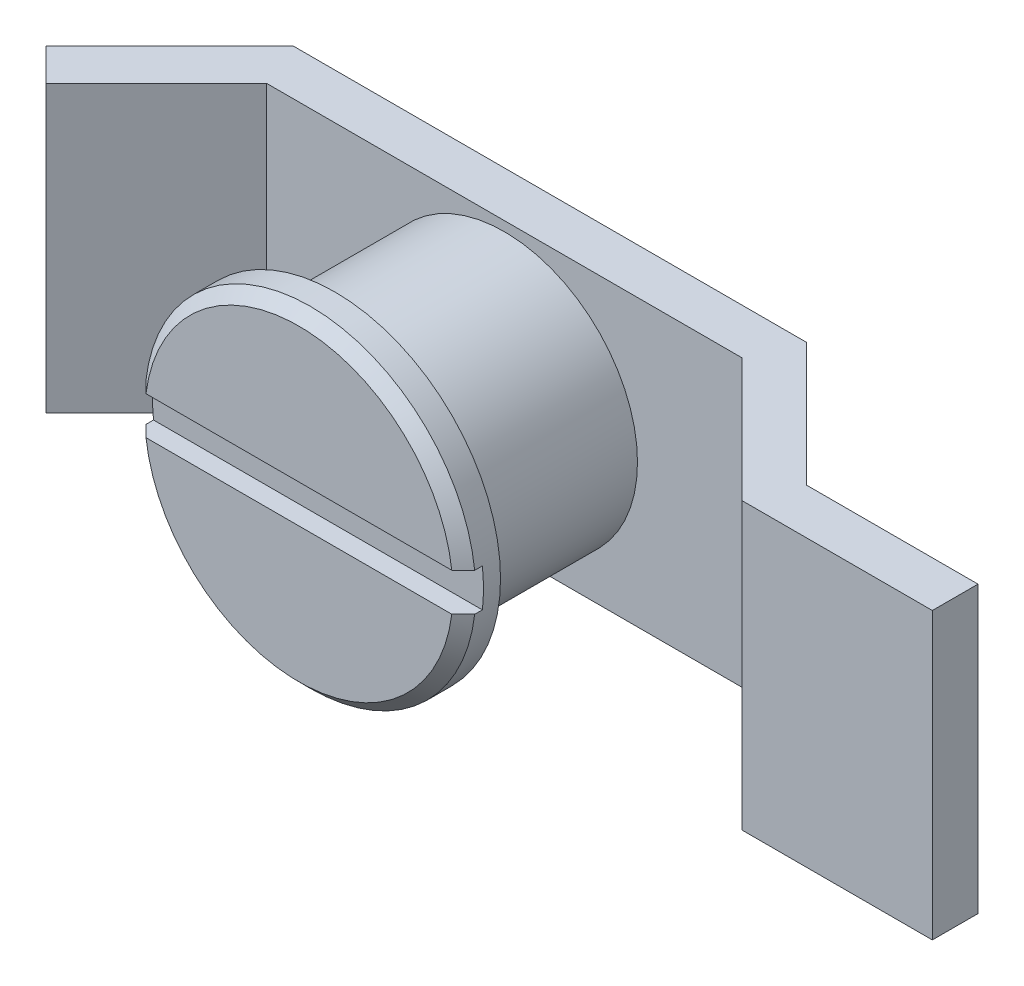
ISO-10303-21;
HEADER;
FILE_DESCRIPTION(('STEP AP214'),'2;1');
FILE_NAME('part.step','',(''),(''),'','','');
FILE_SCHEMA(('AUTOMOTIVE_DESIGN { 1 0 10303 214 1 1 1 1 }'));
ENDSEC;
DATA;
#1=APPLICATION_CONTEXT('core data for automotive mechanical design processes');
#2=APPLICATION_PROTOCOL_DEFINITION('international standard','automotive_design',2000,#1);
#3=PRODUCT_CONTEXT('',#1,'mechanical');
#4=PRODUCT('Part','Part','',(#3));
#5=PRODUCT_RELATED_PRODUCT_CATEGORY('part','',(#4));
#6=PRODUCT_DEFINITION_FORMATION('','',#4);
#7=PRODUCT_DEFINITION_CONTEXT('part definition',#1,'design');
#8=PRODUCT_DEFINITION('design','',#6,#7);
#9=PRODUCT_DEFINITION_SHAPE('','',#8);
#10=(LENGTH_UNIT() NAMED_UNIT(*) SI_UNIT(.MILLI.,.METRE.));
#11=(NAMED_UNIT(*) PLANE_ANGLE_UNIT() SI_UNIT($,.RADIAN.));
#12=(NAMED_UNIT(*) SI_UNIT($,.STERADIAN.) SOLID_ANGLE_UNIT());
#13=UNCERTAINTY_MEASURE_WITH_UNIT(LENGTH_MEASURE(1.E-05),#10,'distance_accuracy_value','');
#14=(GEOMETRIC_REPRESENTATION_CONTEXT(3) GLOBAL_UNCERTAINTY_ASSIGNED_CONTEXT((#13)) GLOBAL_UNIT_ASSIGNED_CONTEXT((#10,
#11,#12)) REPRESENTATION_CONTEXT('',''));
#15=CARTESIAN_POINT('',(0.,0.,0.));
#16=DIRECTION('',(0.,0.,1.));
#17=DIRECTION('',(1.,0.,0.));
#18=AXIS2_PLACEMENT_3D('',#15,#16,#17);
#19=CARTESIAN_POINT('',(327.787,-1.27,325.4375));
#20=DIRECTION('',(0.,0.,1.));
#21=DIRECTION('',(1.,0.,0.));
#22=AXIS2_PLACEMENT_3D('',#19,#20,#21);
#23=PLANE('',#22);
#24=DIRECTION('',(1.,0.,0.));
#25=VECTOR('',#24,1.);
#26=CARTESIAN_POINT('',(327.787,-1.27,325.4375));
#27=LINE('',#26,#25);
#28=CARTESIAN_POINT('',(327.860231188659,-1.27,325.4375));
#29=VERTEX_POINT('',#28);
#30=CARTESIAN_POINT('',(349.811768811341,-1.27,325.4375));
#31=VERTEX_POINT('',#30);
#32=EDGE_CURVE('E129',#29,#31,#27,.T.);
#33=ORIENTED_EDGE('',*,*,#32,.T.);
#34=CARTESIAN_POINT('',(338.836,0.,325.4375));
#35=DIRECTION('',(0.,0.,1.));
#36=DIRECTION('',(1.,0.,0.));
#37=AXIS2_PLACEMENT_3D('',#34,#35,#36);
#38=CIRCLE('',#37,11.0489999999999);
#39=CARTESIAN_POINT('',(349.811768811341,1.27,325.4375));
#40=VERTEX_POINT('',#39);
#41=EDGE_CURVE('E136',#31,#40,#38,.T.);
#42=ORIENTED_EDGE('',*,*,#41,.T.);
#43=DIRECTION('',(1.,0.,0.));
#44=VECTOR('',#43,1.);
#45=CARTESIAN_POINT('',(327.787,1.27,325.4375));
#46=LINE('',#45,#44);
#47=CARTESIAN_POINT('',(327.860231188659,1.27,325.4375));
#48=VERTEX_POINT('',#47);
#49=EDGE_CURVE('E131',#40,#48,#46,.F.);
#50=ORIENTED_EDGE('',*,*,#49,.T.);
#51=CARTESIAN_POINT('',(338.836,0.,325.4375));
#52=DIRECTION('',(0.,0.,1.));
#53=DIRECTION('',(1.,0.,0.));
#54=AXIS2_PLACEMENT_3D('',#51,#52,#53);
#55=CIRCLE('',#54,11.0489999999999);
#56=EDGE_CURVE('E20',#48,#29,#55,.T.);
#57=ORIENTED_EDGE('',*,*,#56,.T.);
#58=EDGE_LOOP('',(#33,#42,#50,#57));
#59=FACE_BOUND('',#58,.T.);
#60=ADVANCED_FACE('F17',(#59),#23,.T.);
#61=CARTESIAN_POINT('',(327.787,-1.27,325.4375));
#62=DIRECTION('',(0.,-1.,0.));
#63=DIRECTION('',(0.,0.,-1.));
#64=AXIS2_PLACEMENT_3D('',#61,#62,#63);
#65=PLANE('',#64);
#66=CARTESIAN_POINT('',(328.627695050374,-1.27000227202775,326.707501914625));
#67=CARTESIAN_POINT('',(328.499752182231,-1.27000113601387,326.580533914244));
#68=CARTESIAN_POINT('',(328.371825392162,-1.27000037867129,326.453549720541));
#69=CARTESIAN_POINT('',(328.116003968263,-1.26999962132871,326.199548946578));
#70=CARTESIAN_POINT('',(327.988109334432,-1.26999962132871,326.072532366318));
#71=CARTESIAN_POINT('',(327.860230778677,-1.27,325.945499592735));
#72=B_SPLINE_CURVE_WITH_KNOTS('',3,(#66,#67,#68,#69,#70,#71),.UNSPECIFIED.,.F.,.F.,(4,2,4),(0.,
0.54075155257568,1.08150310478243),.UNSPECIFIED.);
#73=CARTESIAN_POINT('',(328.627696296441,-1.27,326.707500218524));
#74=VERTEX_POINT('',#73);
#75=CARTESIAN_POINT('',(327.860231188659,-1.27,325.9455));
#76=VERTEX_POINT('',#75);
#77=EDGE_CURVE('E149',#74,#76,#72,.T.);
#78=ORIENTED_EDGE('',*,*,#77,.F.);
#79=DIRECTION('',(-1.,0.,0.));
#80=VECTOR('',#79,1.);
#81=CARTESIAN_POINT('',(328.549,-1.27,326.7075));
#82=LINE('',#81,#80);
#83=CARTESIAN_POINT('',(349.044303971894,-1.27,326.707499952242));
#84=VERTEX_POINT('',#83);
#85=EDGE_CURVE('E457',#74,#84,#82,.F.);
#86=ORIENTED_EDGE('',*,*,#85,.T.);
#87=CARTESIAN_POINT('',(349.811768482112,-1.26999971037997,325.945499950752));
#88=CARTESIAN_POINT('',(349.683890446107,-1.26999985518999,326.072532885104));
#89=CARTESIAN_POINT('',(349.555996056306,-1.26999995173,326.199549348382));
#90=CARTESIAN_POINT('',(349.300174568969,-1.27000004827001,326.453549332933));
#91=CARTESIAN_POINT('',(349.172247471432,-1.27000004827001,326.580532854206));
#92=CARTESIAN_POINT('',(349.044304020099,-1.27,326.707499904405));
#93=B_SPLINE_CURVE_WITH_KNOTS('',3,(#87,#88,#89,#90,#91,#92),.UNSPECIFIED.,.F.,.F.,(4,2,4),(0.,
0.540750785460812,1.0815015715265),.UNSPECIFIED.);
#94=CARTESIAN_POINT('',(349.811768740798,-1.27,325.945500070075));
#95=VERTEX_POINT('',#94);
#96=EDGE_CURVE('E153',#95,#84,#93,.T.);
#97=ORIENTED_EDGE('',*,*,#96,.F.);
#98=DIRECTION('',(0.,0.,-1.));
#99=VECTOR('',#98,1.);
#100=CARTESIAN_POINT('',(349.811768811341,-1.27,325.4375));
#101=LINE('',#100,#99);
#102=EDGE_CURVE('E143',#31,#95,#101,.F.);
#103=ORIENTED_EDGE('',*,*,#102,.F.);
#104=ORIENTED_EDGE('',*,*,#32,.F.);
#105=DIRECTION('',(0.,0.,-1.));
#106=VECTOR('',#105,1.);
#107=CARTESIAN_POINT('',(327.860231188659,-1.27,325.4375));
#108=LINE('',#107,#106);
#109=EDGE_CURVE('E140',#76,#29,#108,.T.);
#110=ORIENTED_EDGE('',*,*,#109,.F.);
#111=EDGE_LOOP('',(#78,#86,#97,#103,#104,#110));
#112=FACE_BOUND('',#111,.T.);
#113=ADVANCED_FACE('F139',(#112),#65,.F.);
#114=CARTESIAN_POINT('',(327.787,1.27,325.4375));
#115=DIRECTION('',(0.,1.,0.));
#116=DIRECTION('',(0.,0.,1.));
#117=AXIS2_PLACEMENT_3D('',#114,#115,#116);
#118=PLANE('',#117);
#119=CARTESIAN_POINT('',(349.044304949626,1.27000227202777,326.707501914625));
#120=CARTESIAN_POINT('',(349.172247817769,1.27000113601388,326.580533914244));
#121=CARTESIAN_POINT('',(349.300174607838,1.27000037867129,326.453549720541));
#122=CARTESIAN_POINT('',(349.555996031737,1.26999962132871,326.199548946578));
#123=CARTESIAN_POINT('',(349.683890665568,1.26999962132871,326.072532366318));
#124=CARTESIAN_POINT('',(349.811769221323,1.27,325.945499592735));
#125=B_SPLINE_CURVE_WITH_KNOTS('',3,(#119,#120,#121,#122,#123,#124),.UNSPECIFIED.,.F.,.F.,(4,2,
4),(0.,0.54075155257568,1.08150310478243),.UNSPECIFIED.);
#126=CARTESIAN_POINT('',(349.044303703559,1.27,326.707500218524));
#127=VERTEX_POINT('',#126);
#128=CARTESIAN_POINT('',(349.811768811341,1.27,325.9455));
#129=VERTEX_POINT('',#128);
#130=EDGE_CURVE('E177',#127,#129,#125,.T.);
#131=ORIENTED_EDGE('',*,*,#130,.F.);
#132=DIRECTION('',(-1.,0.,0.));
#133=VECTOR('',#132,1.);
#134=CARTESIAN_POINT('',(328.549,1.27,326.7075));
#135=LINE('',#134,#133);
#136=CARTESIAN_POINT('',(328.627696028106,1.27,326.707499952242));
#137=VERTEX_POINT('',#136);
#138=EDGE_CURVE('E176',#127,#137,#135,.T.);
#139=ORIENTED_EDGE('',*,*,#138,.T.);
#140=CARTESIAN_POINT('',(327.860231517888,1.26999971037997,325.945499950752));
#141=CARTESIAN_POINT('',(327.988109553893,1.26999985518999,326.072532885104));
#142=CARTESIAN_POINT('',(328.116003943694,1.26999995172999,326.199549348382));
#143=CARTESIAN_POINT('',(328.371825431031,1.27000004827,326.453549332933));
#144=CARTESIAN_POINT('',(328.499752528568,1.27000004827,326.580532854206));
#145=CARTESIAN_POINT('',(328.627695979901,1.27,326.707499904405));
#146=B_SPLINE_CURVE_WITH_KNOTS('',3,(#140,#141,#142,#143,#144,#145),.UNSPECIFIED.,.F.,.F.,(4,2,
4),(0.,0.540750785460773,1.08150157152642),.UNSPECIFIED.);
#147=CARTESIAN_POINT('',(327.860231259202,1.27,325.945500070075));
#148=VERTEX_POINT('',#147);
#149=EDGE_CURVE('E186',#148,#137,#146,.T.);
#150=ORIENTED_EDGE('',*,*,#149,.F.);
#151=DIRECTION('',(0.,0.,1.));
#152=VECTOR('',#151,1.);
#153=CARTESIAN_POINT('',(327.860231188659,1.27,325.4375));
#154=LINE('',#153,#152);
#155=EDGE_CURVE('E151',#48,#148,#154,.T.);
#156=ORIENTED_EDGE('',*,*,#155,.F.);
#157=ORIENTED_EDGE('',*,*,#49,.F.);
#158=DIRECTION('',(0.,0.,1.));
#159=VECTOR('',#158,1.);
#160=CARTESIAN_POINT('',(349.811768811341,1.27,325.4375));
#161=LINE('',#160,#159);
#162=EDGE_CURVE('E185',#129,#40,#161,.F.);
#163=ORIENTED_EDGE('',*,*,#162,.F.);
#164=EDGE_LOOP('',(#131,#139,#150,#156,#157,#163));
#165=FACE_BOUND('',#164,.T.);
#166=ADVANCED_FACE('F190',(#165),#118,.F.);
#167=CARTESIAN_POINT('',(328.549,0.,326.7075));
#168=DIRECTION('',(0.,0.,-1.));
#169=DIRECTION('',(-1.,0.,0.));
#170=AXIS2_PLACEMENT_3D('',#167,#168,#169);
#171=PLANE('',#170);
#172=CARTESIAN_POINT('',(338.836,0.,326.7075));
#173=DIRECTION('',(0.,0.,-1.));
#174=DIRECTION('',(-1.,0.,0.));
#175=AXIS2_PLACEMENT_3D('',#172,#173,#174);
#176=CIRCLE('',#175,10.2869999999999);
#177=EDGE_CURVE('E173',#84,#74,#176,.T.);
#178=ORIENTED_EDGE('',*,*,#177,.F.);
#179=ORIENTED_EDGE('',*,*,#85,.F.);
#180=EDGE_LOOP('',(#178,#179));
#181=FACE_BOUND('',#180,.T.);
#182=ADVANCED_FACE('F223',(#181),#171,.F.);
#183=CARTESIAN_POINT('',(328.549,0.,326.7075));
#184=DIRECTION('',(0.,0.,-1.));
#185=DIRECTION('',(-1.,0.,0.));
#186=AXIS2_PLACEMENT_3D('',#183,#184,#185);
#187=PLANE('',#186);
#188=CARTESIAN_POINT('',(338.836,0.,326.7075));
#189=DIRECTION('',(0.,0.,-1.));
#190=DIRECTION('',(-1.,0.,0.));
#191=AXIS2_PLACEMENT_3D('',#188,#189,#190);
#192=CIRCLE('',#191,10.2869999999999);
#193=EDGE_CURVE('E170',#137,#127,#192,.T.);
#194=ORIENTED_EDGE('',*,*,#193,.F.);
#195=ORIENTED_EDGE('',*,*,#138,.F.);
#196=EDGE_LOOP('',(#194,#195));
#197=FACE_BOUND('',#196,.T.);
#198=ADVANCED_FACE('F205',(#197),#187,.F.);
#199=CARTESIAN_POINT('',(338.836,0.,325.9455));
#200=DIRECTION('',(0.,0.,-1.));
#201=DIRECTION('',(-1.,0.,0.));
#202=AXIS2_PLACEMENT_3D('',#199,#200,#201);
#203=CONICAL_SURFACE('',#202,11.0489999999999,0.785398163397448);
#204=ORIENTED_EDGE('',*,*,#77,.T.);
#205=CARTESIAN_POINT('',(338.836,0.,325.9455));
#206=DIRECTION('',(0.,0.,1.));
#207=DIRECTION('',(1.,0.,0.));
#208=AXIS2_PLACEMENT_3D('',#205,#206,#207);
#209=CIRCLE('',#208,11.0489999999999);
#210=EDGE_CURVE('E147',#95,#76,#209,.F.);
#211=ORIENTED_EDGE('',*,*,#210,.F.);
#212=ORIENTED_EDGE('',*,*,#96,.T.);
#213=ORIENTED_EDGE('',*,*,#177,.T.);
#214=EDGE_LOOP('',(#204,#211,#212,#213));
#215=FACE_BOUND('',#214,.T.);
#216=ADVANCED_FACE('F198',(#215),#203,.T.);
#217=CARTESIAN_POINT('',(338.836,0.,325.9455));
#218=DIRECTION('',(0.,0.,-1.));
#219=DIRECTION('',(-1.,0.,0.));
#220=AXIS2_PLACEMENT_3D('',#217,#218,#219);
#221=CONICAL_SURFACE('',#220,11.0489999999999,0.785398163397448);
#222=ORIENTED_EDGE('',*,*,#130,.T.);
#223=CARTESIAN_POINT('',(338.836,0.,325.9455));
#224=DIRECTION('',(0.,0.,1.));
#225=DIRECTION('',(1.,0.,0.));
#226=AXIS2_PLACEMENT_3D('',#223,#224,#225);
#227=CIRCLE('',#226,11.0489999999999);
#228=EDGE_CURVE('E169',#148,#129,#227,.F.);
#229=ORIENTED_EDGE('',*,*,#228,.F.);
#230=ORIENTED_EDGE('',*,*,#149,.T.);
#231=ORIENTED_EDGE('',*,*,#193,.T.);
#232=EDGE_LOOP('',(#222,#229,#230,#231));
#233=FACE_BOUND('',#232,.T.);
#234=ADVANCED_FACE('F193',(#233),#221,.T.);
#235=CARTESIAN_POINT('',(338.836,0.,326.7075));
#236=DIRECTION('',(0.,0.,1.));
#237=DIRECTION('',(1.,0.,0.));
#238=AXIS2_PLACEMENT_3D('',#235,#236,#237);
#239=CYLINDRICAL_SURFACE('',#238,11.0489999999999);
#240=CARTESIAN_POINT('',(338.836,0.,324.2945));
#241=DIRECTION('',(0.,0.,1.));
#242=DIRECTION('',(1.,0.,0.));
#243=AXIS2_PLACEMENT_3D('',#240,#241,#242);
#244=CIRCLE('',#243,11.0489999999999);
#245=CARTESIAN_POINT('',(349.885,0.,324.2945));
#246=VERTEX_POINT('',#245);
#247=EDGE_CURVE('E166',#246,#246,#244,.T.);
#248=ORIENTED_EDGE('',*,*,#247,.T.);
#249=EDGE_LOOP('',(#248));
#250=FACE_BOUND('',#249,.T.);
#251=ORIENTED_EDGE('',*,*,#41,.F.);
#252=ORIENTED_EDGE('',*,*,#102,.T.);
#253=ORIENTED_EDGE('',*,*,#210,.T.);
#254=ORIENTED_EDGE('',*,*,#109,.T.);
#255=ORIENTED_EDGE('',*,*,#56,.F.);
#256=ORIENTED_EDGE('',*,*,#155,.T.);
#257=ORIENTED_EDGE('',*,*,#228,.T.);
#258=ORIENTED_EDGE('',*,*,#162,.T.);
#259=EDGE_LOOP('',(#251,#252,#253,#254,#255,#256,#257,#258));
#260=FACE_BOUND('',#259,.T.);
#261=ADVANCED_FACE('F145',(#250,#260),#239,.T.);
#262=CARTESIAN_POINT('',(329.946,0.,324.2945));
#263=DIRECTION('',(0.,0.,1.));
#264=DIRECTION('',(1.,0.,0.));
#265=AXIS2_PLACEMENT_3D('',#262,#263,#264);
#266=PLANE('',#265);
#267=CARTESIAN_POINT('',(338.836,0.,324.2945));
#268=DIRECTION('',(0.,0.,1.));
#269=DIRECTION('',(1.,0.,0.));
#270=AXIS2_PLACEMENT_3D('',#267,#268,#269);
#271=CIRCLE('',#270,8.88999999999995);
#272=CARTESIAN_POINT('',(347.726,0.,324.2945));
#273=VERTEX_POINT('',#272);
#274=EDGE_CURVE('E163',#273,#273,#271,.F.);
#275=ORIENTED_EDGE('',*,*,#274,.F.);
#276=EDGE_LOOP('',(#275));
#277=FACE_BOUND('',#276,.T.);
#278=ORIENTED_EDGE('',*,*,#247,.F.);
#279=EDGE_LOOP('',(#278));
#280=FACE_BOUND('',#279,.T.);
#281=ADVANCED_FACE('F278',(#277,#280),#266,.F.);
#282=CARTESIAN_POINT('',(338.836,0.,326.7075));
#283=DIRECTION('',(0.,0.,1.));
#284=DIRECTION('',(1.,0.,0.));
#285=AXIS2_PLACEMENT_3D('',#282,#283,#284);
#286=CYLINDRICAL_SURFACE('',#285,8.88999999999995);
#287=CARTESIAN_POINT('',(338.836,0.,312.9915));
#288=DIRECTION('',(0.,0.,1.));
#289=DIRECTION('',(1.,0.,0.));
#290=AXIS2_PLACEMENT_3D('',#287,#288,#289);
#291=CIRCLE('',#290,8.88999999999995);
#292=CARTESIAN_POINT('',(347.726,0.,312.9915));
#293=VERTEX_POINT('',#292);
#294=EDGE_CURVE('E158',#293,#293,#291,.T.);
#295=ORIENTED_EDGE('',*,*,#294,.T.);
#296=EDGE_LOOP('',(#295));
#297=FACE_BOUND('',#296,.T.);
#298=ORIENTED_EDGE('',*,*,#274,.T.);
#299=EDGE_LOOP('',(#298));
#300=FACE_BOUND('',#299,.T.);
#301=ADVANCED_FACE('F275',(#297,#300),#286,.T.);
#302=CARTESIAN_POINT('',(315.598738530943,9.525,320.353761469057));
#303=DIRECTION('',(-0.707106781186548,0.,-0.707106781186548));
#304=DIRECTION('',(-0.707106781186548,0.,0.707106781186548));
#305=AXIS2_PLACEMENT_3D('',#302,#303,#304);
#306=PLANE('',#305);
#307=DIRECTION('',(0.707106781186548,0.,-0.707106781186548));
#308=VECTOR('',#307,1.);
#309=CARTESIAN_POINT('',(315.598738530943,9.525,320.353761469057));
#310=LINE('',#309,#308);
#311=CARTESIAN_POINT('',(315.598738530943,9.525,320.353761469057));
#312=VERTEX_POINT('',#311);
#313=CARTESIAN_POINT('',(322.961,9.525,312.9915));
#314=VERTEX_POINT('',#313);
#315=EDGE_CURVE('E511',#312,#314,#310,.T.);
#316=ORIENTED_EDGE('',*,*,#315,.F.);
#317=DIRECTION('',(0.,1.,0.));
#318=VECTOR('',#317,1.);
#319=CARTESIAN_POINT('',(315.598738530943,9.525,320.353761469057));
#320=LINE('',#319,#318);
#321=CARTESIAN_POINT('',(315.598738530943,-9.52500000000001,320.353761469057));
#322=VERTEX_POINT('',#321);
#323=EDGE_CURVE('E480',#312,#322,#320,.F.);
#324=ORIENTED_EDGE('',*,*,#323,.T.);
#325=DIRECTION('',(0.707106781186548,0.,-0.707106781186548));
#326=VECTOR('',#325,1.);
#327=CARTESIAN_POINT('',(315.598738530943,-9.525,320.353761469057));
#328=LINE('',#327,#326);
#329=CARTESIAN_POINT('',(322.961,-9.525,312.9915));
#330=VERTEX_POINT('',#329);
#331=EDGE_CURVE('E485',#322,#330,#328,.T.);
#332=ORIENTED_EDGE('',*,*,#331,.T.);
#333=DIRECTION('',(0.,1.,0.));
#334=VECTOR('',#333,1.);
#335=CARTESIAN_POINT('',(322.961,9.525,312.9915));
#336=LINE('',#335,#334);
#337=EDGE_CURVE('E162',#330,#314,#336,.T.);
#338=ORIENTED_EDGE('',*,*,#337,.T.);
#339=EDGE_LOOP('',(#316,#324,#332,#338));
#340=FACE_BOUND('',#339,.T.);
#341=ADVANCED_FACE('F271',(#340),#306,.F.);
#342=CARTESIAN_POINT('',(354.711,9.525,312.9915));
#343=DIRECTION('',(0.,0.,-1.));
#344=DIRECTION('',(-1.,0.,0.));
#345=AXIS2_PLACEMENT_3D('',#342,#343,#344);
#346=PLANE('',#345);
#347=ORIENTED_EDGE('',*,*,#294,.F.);
#348=EDGE_LOOP('',(#347));
#349=FACE_BOUND('',#348,.T.);
#350=DIRECTION('',(1.,0.,0.));
#351=VECTOR('',#350,1.);
#352=CARTESIAN_POINT('',(340.991261469057,9.525,312.9915));
#353=LINE('',#352,#351);
#354=CARTESIAN_POINT('',(354.711,9.525,312.9915));
#355=VERTEX_POINT('',#354);
#356=EDGE_CURVE('E513',#314,#355,#353,.T.);
#357=ORIENTED_EDGE('',*,*,#356,.F.);
#358=ORIENTED_EDGE('',*,*,#337,.F.);
#359=DIRECTION('',(1.,0.,0.));
#360=VECTOR('',#359,1.);
#361=CARTESIAN_POINT('',(340.991261469057,-9.525,312.9915));
#362=LINE('',#361,#360);
#363=CARTESIAN_POINT('',(354.711,-9.525,312.9915));
#364=VERTEX_POINT('',#363);
#365=EDGE_CURVE('E488',#330,#364,#362,.T.);
#366=ORIENTED_EDGE('',*,*,#365,.T.);
#367=DIRECTION('',(0.,1.,0.));
#368=VECTOR('',#367,1.);
#369=CARTESIAN_POINT('',(354.711,9.525,312.9915));
#370=LINE('',#369,#368);
#371=EDGE_CURVE('E161',#364,#355,#370,.T.);
#372=ORIENTED_EDGE('',*,*,#371,.T.);
#373=EDGE_LOOP('',(#357,#358,#366,#372));
#374=FACE_BOUND('',#373,.T.);
#375=ADVANCED_FACE('F267',(#349,#374),#346,.F.);
#376=CARTESIAN_POINT('',(362.966,9.525,321.2465));
#377=DIRECTION('',(0.707106781186548,0.,-0.707106781186548));
#378=DIRECTION('',(-0.707106781186548,0.,-0.707106781186548));
#379=AXIS2_PLACEMENT_3D('',#376,#377,#378);
#380=PLANE('',#379);
#381=DIRECTION('',(0.707106781186548,0.,0.707106781186548));
#382=VECTOR('',#381,1.);
#383=CARTESIAN_POINT('',(354.711,9.525,312.9915));
#384=LINE('',#383,#382);
#385=CARTESIAN_POINT('',(362.966,9.525,321.2465));
#386=VERTEX_POINT('',#385);
#387=EDGE_CURVE('E515',#355,#386,#384,.T.);
#388=ORIENTED_EDGE('',*,*,#387,.F.);
#389=ORIENTED_EDGE('',*,*,#371,.F.);
#390=DIRECTION('',(0.707106781186548,0.,0.707106781186548));
#391=VECTOR('',#390,1.);
#392=CARTESIAN_POINT('',(354.711,-9.525,312.9915));
#393=LINE('',#392,#391);
#394=CARTESIAN_POINT('',(362.966,-9.525,321.2465));
#395=VERTEX_POINT('',#394);
#396=EDGE_CURVE('E491',#364,#395,#393,.T.);
#397=ORIENTED_EDGE('',*,*,#396,.T.);
#398=DIRECTION('',(0.,1.,0.));
#399=VECTOR('',#398,1.);
#400=CARTESIAN_POINT('',(362.966,9.525,321.2465));
#401=LINE('',#400,#399);
#402=EDGE_CURVE('E471',#395,#386,#401,.T.);
#403=ORIENTED_EDGE('',*,*,#402,.T.);
#404=EDGE_LOOP('',(#388,#389,#397,#403));
#405=FACE_BOUND('',#404,.T.);
#406=ADVANCED_FACE('F263',(#405),#380,.F.);
#407=CARTESIAN_POINT('',(375.666,9.525,321.2465));
#408=DIRECTION('',(0.,0.,-1.));
#409=DIRECTION('',(-1.,0.,0.));
#410=AXIS2_PLACEMENT_3D('',#407,#408,#409);
#411=PLANE('',#410);
#412=DIRECTION('',(1.,0.,0.));
#413=VECTOR('',#412,1.);
#414=CARTESIAN_POINT('',(340.991261469057,9.525,321.2465));
#415=LINE('',#414,#413);
#416=CARTESIAN_POINT('',(375.666,9.525,321.2465));
#417=VERTEX_POINT('',#416);
#418=EDGE_CURVE('E517',#386,#417,#415,.T.);
#419=ORIENTED_EDGE('',*,*,#418,.F.);
#420=ORIENTED_EDGE('',*,*,#402,.F.);
#421=DIRECTION('',(1.,0.,0.));
#422=VECTOR('',#421,1.);
#423=CARTESIAN_POINT('',(340.991261469057,-9.525,321.2465));
#424=LINE('',#423,#422);
#425=CARTESIAN_POINT('',(375.666,-9.525,321.2465));
#426=VERTEX_POINT('',#425);
#427=EDGE_CURVE('E494',#395,#426,#424,.T.);
#428=ORIENTED_EDGE('',*,*,#427,.T.);
#429=DIRECTION('',(0.,1.,0.));
#430=VECTOR('',#429,1.);
#431=CARTESIAN_POINT('',(375.666,9.525,321.2465));
#432=LINE('',#431,#430);
#433=EDGE_CURVE('E474',#426,#417,#432,.T.);
#434=ORIENTED_EDGE('',*,*,#433,.T.);
#435=EDGE_LOOP('',(#419,#420,#428,#434));
#436=FACE_BOUND('',#435,.T.);
#437=ADVANCED_FACE('F259',(#436),#411,.F.);
#438=CARTESIAN_POINT('',(375.666,9.525,318.1985));
#439=DIRECTION('',(-1.,0.,0.));
#440=DIRECTION('',(0.,0.,1.));
#441=AXIS2_PLACEMENT_3D('',#438,#439,#440);
#442=PLANE('',#441);
#443=DIRECTION('',(0.,0.,1.));
#444=VECTOR('',#443,1.);
#445=CARTESIAN_POINT('',(375.666,9.525,294.961238530943));
#446=LINE('',#445,#444);
#447=CARTESIAN_POINT('',(375.666,9.525,318.1985));
#448=VERTEX_POINT('',#447);
#449=EDGE_CURVE('E519',#417,#448,#446,.F.);
#450=ORIENTED_EDGE('',*,*,#449,.F.);
#451=ORIENTED_EDGE('',*,*,#433,.F.);
#452=DIRECTION('',(0.,0.,1.));
#453=VECTOR('',#452,1.);
#454=CARTESIAN_POINT('',(375.666,-9.525,294.961238530943));
#455=LINE('',#454,#453);
#456=CARTESIAN_POINT('',(375.666,-9.525,318.1985));
#457=VERTEX_POINT('',#456);
#458=EDGE_CURVE('E497',#426,#457,#455,.F.);
#459=ORIENTED_EDGE('',*,*,#458,.T.);
#460=DIRECTION('',(0.,1.,0.));
#461=VECTOR('',#460,1.);
#462=CARTESIAN_POINT('',(375.666,9.525,318.1985));
#463=LINE('',#462,#461);
#464=EDGE_CURVE('E477',#457,#448,#463,.T.);
#465=ORIENTED_EDGE('',*,*,#464,.T.);
#466=EDGE_LOOP('',(#450,#451,#459,#465));
#467=FACE_BOUND('',#466,.T.);
#468=ADVANCED_FACE('F255',(#467),#442,.F.);
#469=CARTESIAN_POINT('',(364.228522938113,9.525,318.1985));
#470=DIRECTION('',(0.,0.,1.));
#471=DIRECTION('',(1.,0.,0.));
#472=AXIS2_PLACEMENT_3D('',#469,#470,#471);
#473=PLANE('',#472);
#474=DIRECTION('',(1.,0.,0.));
#475=VECTOR('',#474,1.);
#476=CARTESIAN_POINT('',(340.991261469057,9.525,318.1985));
#477=LINE('',#476,#475);
#478=CARTESIAN_POINT('',(364.228522938113,9.525,318.1985));
#479=VERTEX_POINT('',#478);
#480=EDGE_CURVE('E521',#448,#479,#477,.F.);
#481=ORIENTED_EDGE('',*,*,#480,.F.);
#482=ORIENTED_EDGE('',*,*,#464,.F.);
#483=DIRECTION('',(1.,0.,0.));
#484=VECTOR('',#483,1.);
#485=CARTESIAN_POINT('',(340.991261469057,-9.525,318.1985));
#486=LINE('',#485,#484);
#487=CARTESIAN_POINT('',(364.228522938113,-9.525,318.1985));
#488=VERTEX_POINT('',#487);
#489=EDGE_CURVE('E500',#457,#488,#486,.F.);
#490=ORIENTED_EDGE('',*,*,#489,.T.);
#491=DIRECTION('',(0.,1.,0.));
#492=VECTOR('',#491,1.);
#493=CARTESIAN_POINT('',(364.228522938113,9.525,318.1985));
#494=LINE('',#493,#492);
#495=EDGE_CURVE('E505',#488,#479,#494,.T.);
#496=ORIENTED_EDGE('',*,*,#495,.T.);
#497=EDGE_LOOP('',(#481,#482,#490,#496));
#498=FACE_BOUND('',#497,.T.);
#499=ADVANCED_FACE('F251',(#498),#473,.F.);
#500=CARTESIAN_POINT('',(313.443477061887,9.525,318.1985));
#501=DIRECTION('',(0.707106781186538,0.,-0.707106781186557));
#502=DIRECTION('',(-0.707106781186557,0.,-0.707106781186538));
#503=AXIS2_PLACEMENT_3D('',#500,#501,#502);
#504=PLANE('',#503);
#505=DIRECTION('',(0.707106781186557,0.,0.707106781186538));
#506=VECTOR('',#505,1.);
#507=CARTESIAN_POINT('',(313.443477061887,9.525,318.1985));
#508=LINE('',#507,#506);
#509=CARTESIAN_POINT('',(313.443477061887,9.525,318.1985));
#510=VERTEX_POINT('',#509);
#511=EDGE_CURVE('E508',#510,#312,#508,.T.);
#512=ORIENTED_EDGE('',*,*,#511,.F.);
#513=DIRECTION('',(0.,1.,0.));
#514=VECTOR('',#513,1.);
#515=CARTESIAN_POINT('',(313.443477061887,9.525,318.1985));
#516=LINE('',#515,#514);
#517=CARTESIAN_POINT('',(313.443477061887,-9.525,318.1985));
#518=VERTEX_POINT('',#517);
#519=EDGE_CURVE('E529',#510,#518,#516,.F.);
#520=ORIENTED_EDGE('',*,*,#519,.T.);
#521=DIRECTION('',(0.707106781186557,0.,0.707106781186538));
#522=VECTOR('',#521,1.);
#523=CARTESIAN_POINT('',(313.443477061887,-9.525,318.1985));
#524=LINE('',#523,#522);
#525=EDGE_CURVE('E482',#518,#322,#524,.T.);
#526=ORIENTED_EDGE('',*,*,#525,.T.);
#527=ORIENTED_EDGE('',*,*,#323,.F.);
#528=EDGE_LOOP('',(#512,#520,#526,#527));
#529=FACE_BOUND('',#528,.T.);
#530=ADVANCED_FACE('F247',(#529),#504,.F.);
#531=CARTESIAN_POINT('',(340.991261469057,-9.525,294.961238530943));
#532=DIRECTION('',(0.,1.,0.));
#533=DIRECTION('',(0.,0.,1.));
#534=AXIS2_PLACEMENT_3D('',#531,#532,#533);
#535=PLANE('',#534);
#536=ORIENTED_EDGE('',*,*,#458,.F.);
#537=ORIENTED_EDGE('',*,*,#427,.F.);
#538=ORIENTED_EDGE('',*,*,#396,.F.);
#539=ORIENTED_EDGE('',*,*,#365,.F.);
#540=ORIENTED_EDGE('',*,*,#331,.F.);
#541=ORIENTED_EDGE('',*,*,#525,.F.);
#542=DIRECTION('',(0.70710678118655,0.,-0.707106781186545));
#543=VECTOR('',#542,1.);
#544=CARTESIAN_POINT('',(321.698477061887,-9.52499999999999,309.9435));
#545=LINE('',#544,#543);
#546=CARTESIAN_POINT('',(321.698477061887,-9.525,309.9435));
#547=VERTEX_POINT('',#546);
#548=EDGE_CURVE('E525',#518,#547,#545,.T.);
#549=ORIENTED_EDGE('',*,*,#548,.T.);
#550=DIRECTION('',(1.,0.,0.));
#551=VECTOR('',#550,1.);
#552=CARTESIAN_POINT('',(321.698477061887,-9.525,309.9435));
#553=LINE('',#552,#551);
#554=CARTESIAN_POINT('',(355.973522938113,-9.525,309.9435));
#555=VERTEX_POINT('',#554);
#556=EDGE_CURVE('E532',#547,#555,#553,.T.);
#557=ORIENTED_EDGE('',*,*,#556,.T.);
#558=DIRECTION('',(0.70710678118655,0.,0.707106781186545));
#559=VECTOR('',#558,1.);
#560=CARTESIAN_POINT('',(355.973522938113,-9.52499999999999,309.9435));
#561=LINE('',#560,#559);
#562=EDGE_CURVE('E502',#555,#488,#561,.T.);
#563=ORIENTED_EDGE('',*,*,#562,.T.);
#564=ORIENTED_EDGE('',*,*,#489,.F.);
#565=EDGE_LOOP('',(#536,#537,#538,#539,#540,#541,#549,#557,#563,#564));
#566=FACE_BOUND('',#565,.T.);
#567=ADVANCED_FACE('F243',(#566),#535,.F.);
#568=CARTESIAN_POINT('',(355.973522938113,9.525,309.9435));
#569=DIRECTION('',(-0.707106781186545,0.,0.70710678118655));
#570=DIRECTION('',(0.70710678118655,0.,0.707106781186545));
#571=AXIS2_PLACEMENT_3D('',#568,#569,#570);
#572=PLANE('',#571);
#573=DIRECTION('',(-0.70710678118655,0.,-0.707106781186545));
#574=VECTOR('',#573,1.);
#575=CARTESIAN_POINT('',(364.228522938113,9.525,318.1985));
#576=LINE('',#575,#574);
#577=CARTESIAN_POINT('',(355.973522938113,9.525,309.9435));
#578=VERTEX_POINT('',#577);
#579=EDGE_CURVE('E523',#479,#578,#576,.T.);
#580=ORIENTED_EDGE('',*,*,#579,.F.);
#581=ORIENTED_EDGE('',*,*,#495,.F.);
#582=ORIENTED_EDGE('',*,*,#562,.F.);
#583=DIRECTION('',(0.,1.,0.));
#584=VECTOR('',#583,1.);
#585=CARTESIAN_POINT('',(355.973522938113,9.525,309.9435));
#586=LINE('',#585,#584);
#587=EDGE_CURVE('E535',#555,#578,#586,.T.);
#588=ORIENTED_EDGE('',*,*,#587,.T.);
#589=EDGE_LOOP('',(#580,#581,#582,#588));
#590=FACE_BOUND('',#589,.T.);
#591=ADVANCED_FACE('F239',(#590),#572,.F.);
#592=CARTESIAN_POINT('',(340.991261469057,9.525,294.961238530943));
#593=DIRECTION('',(0.,1.,0.));
#594=DIRECTION('',(0.,0.,1.));
#595=AXIS2_PLACEMENT_3D('',#592,#593,#594);
#596=PLANE('',#595);
#597=ORIENTED_EDGE('',*,*,#480,.T.);
#598=ORIENTED_EDGE('',*,*,#579,.T.);
#599=DIRECTION('',(1.,0.,0.));
#600=VECTOR('',#599,1.);
#601=CARTESIAN_POINT('',(321.698477061887,9.525,309.9435));
#602=LINE('',#601,#600);
#603=CARTESIAN_POINT('',(321.698477061887,9.525,309.9435));
#604=VERTEX_POINT('',#603);
#605=EDGE_CURVE('E26',#578,#604,#602,.F.);
#606=ORIENTED_EDGE('',*,*,#605,.T.);
#607=DIRECTION('',(0.70710678118655,0.,-0.707106781186545));
#608=VECTOR('',#607,1.);
#609=CARTESIAN_POINT('',(321.698477061887,9.525,309.9435));
#610=LINE('',#609,#608);
#611=EDGE_CURVE('E34',#604,#510,#610,.F.);
#612=ORIENTED_EDGE('',*,*,#611,.T.);
#613=ORIENTED_EDGE('',*,*,#511,.T.);
#614=ORIENTED_EDGE('',*,*,#315,.T.);
#615=ORIENTED_EDGE('',*,*,#356,.T.);
#616=ORIENTED_EDGE('',*,*,#387,.T.);
#617=ORIENTED_EDGE('',*,*,#418,.T.);
#618=ORIENTED_EDGE('',*,*,#449,.T.);
#619=EDGE_LOOP('',(#597,#598,#606,#612,#613,#614,#615,#616,#617,#618));
#620=FACE_BOUND('',#619,.T.);
#621=ADVANCED_FACE('F233',(#620),#596,.T.);
#622=CARTESIAN_POINT('',(321.698477061887,9.525,309.9435));
#623=DIRECTION('',(0.707106781186545,0.,0.70710678118655));
#624=DIRECTION('',(0.70710678118655,0.,-0.707106781186545));
#625=AXIS2_PLACEMENT_3D('',#622,#623,#624);
#626=PLANE('',#625);
#627=ORIENTED_EDGE('',*,*,#611,.F.);
#628=DIRECTION('',(0.,1.,0.));
#629=VECTOR('',#628,1.);
#630=CARTESIAN_POINT('',(321.698477061887,9.525,309.9435));
#631=LINE('',#630,#629);
#632=EDGE_CURVE('E11',#604,#547,#631,.F.);
#633=ORIENTED_EDGE('',*,*,#632,.T.);
#634=ORIENTED_EDGE('',*,*,#548,.F.);
#635=ORIENTED_EDGE('',*,*,#519,.F.);
#636=EDGE_LOOP('',(#627,#633,#634,#635));
#637=FACE_BOUND('',#636,.T.);
#638=ADVANCED_FACE('F227',(#637),#626,.F.);
#639=CARTESIAN_POINT('',(321.698477061887,9.525,309.9435));
#640=DIRECTION('',(0.,0.,1.));
#641=DIRECTION('',(1.,0.,0.));
#642=AXIS2_PLACEMENT_3D('',#639,#640,#641);
#643=PLANE('',#642);
#644=ORIENTED_EDGE('',*,*,#605,.F.);
#645=ORIENTED_EDGE('',*,*,#587,.F.);
#646=ORIENTED_EDGE('',*,*,#556,.F.);
#647=ORIENTED_EDGE('',*,*,#632,.F.);
#648=EDGE_LOOP('',(#644,#645,#646,#647));
#649=FACE_BOUND('',#648,.T.);
#650=ADVANCED_FACE('F225',(#649),#643,.F.);
#651=CLOSED_SHELL('',(#60,#113,#166,#182,#198,#216,#234,#261,#281,#301,#341,#375,#406,#437,#468,
#499,#530,#567,#591,#621,#638,#650));
#652=MANIFOLD_SOLID_BREP('B1',#651);
#653=ADVANCED_BREP_SHAPE_REPRESENTATION('',(#18,#652),#14);
#654=SHAPE_DEFINITION_REPRESENTATION(#9,#653);
ENDSEC;
END-ISO-10303-21;
